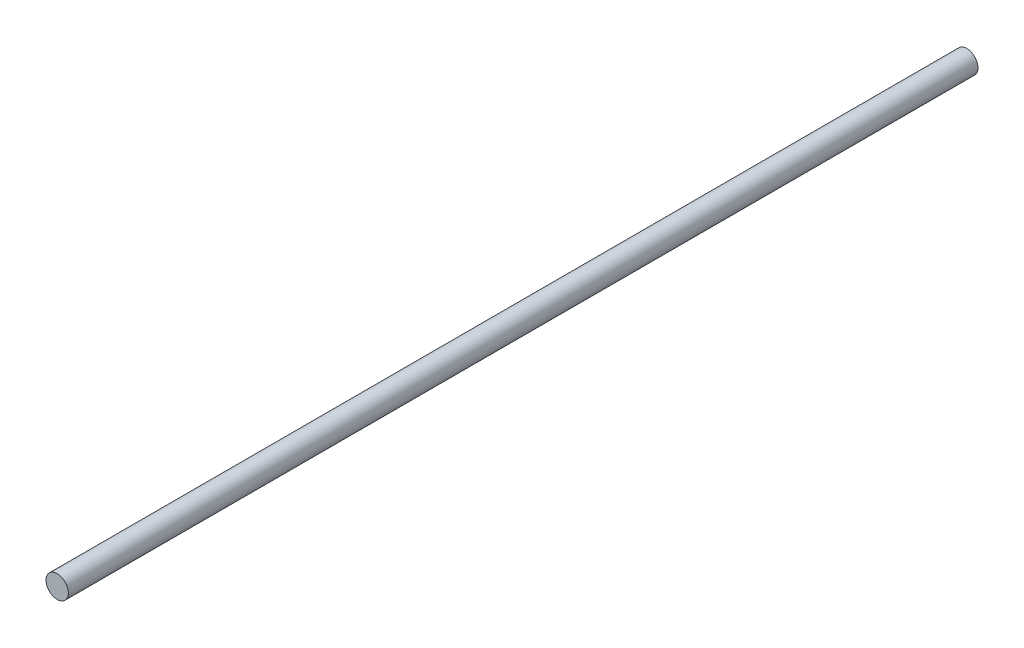
ISO-10303-21;
HEADER;
FILE_DESCRIPTION(('STEP AP214'),'2;1');
FILE_NAME('part.step','',(''),(''),'','','');
FILE_SCHEMA(('AUTOMOTIVE_DESIGN { 1 0 10303 214 1 1 1 1 }'));
ENDSEC;
DATA;
#1=APPLICATION_CONTEXT('core data for automotive mechanical design processes');
#2=APPLICATION_PROTOCOL_DEFINITION('international standard','automotive_design',2000,#1);
#3=PRODUCT_CONTEXT('',#1,'mechanical');
#4=PRODUCT('Part','Part','',(#3));
#5=PRODUCT_RELATED_PRODUCT_CATEGORY('part','',(#4));
#6=PRODUCT_DEFINITION_FORMATION('','',#4);
#7=PRODUCT_DEFINITION_CONTEXT('part definition',#1,'design');
#8=PRODUCT_DEFINITION('design','',#6,#7);
#9=PRODUCT_DEFINITION_SHAPE('','',#8);
#10=(LENGTH_UNIT() NAMED_UNIT(*) SI_UNIT(.MILLI.,.METRE.));
#11=(NAMED_UNIT(*) PLANE_ANGLE_UNIT() SI_UNIT($,.RADIAN.));
#12=(NAMED_UNIT(*) SI_UNIT($,.STERADIAN.) SOLID_ANGLE_UNIT());
#13=UNCERTAINTY_MEASURE_WITH_UNIT(LENGTH_MEASURE(1.E-05),#10,'distance_accuracy_value','');
#14=(GEOMETRIC_REPRESENTATION_CONTEXT(3) GLOBAL_UNCERTAINTY_ASSIGNED_CONTEXT((#13)) GLOBAL_UNIT_ASSIGNED_CONTEXT((#10,
#11,#12)) REPRESENTATION_CONTEXT('',''));
#15=CARTESIAN_POINT('',(0.,0.,0.));
#16=DIRECTION('',(0.,0.,1.));
#17=DIRECTION('',(1.,0.,0.));
#18=AXIS2_PLACEMENT_3D('',#15,#16,#17);
#19=CARTESIAN_POINT('',(0.,0.,4133.088));
#20=DIRECTION('',(0.,0.,-1.));
#21=DIRECTION('',(-1.,0.,0.));
#22=AXIS2_PLACEMENT_3D('',#19,#20,#21);
#23=CYLINDRICAL_SURFACE('',#22,50.8);
#24=CARTESIAN_POINT('',(0.,0.,4133.088));
#25=DIRECTION('',(0.,0.,1.));
#26=DIRECTION('',(1.,0.,0.));
#27=AXIS2_PLACEMENT_3D('',#24,#25,#26);
#28=CIRCLE('',#27,50.8);
#29=CARTESIAN_POINT('',(50.8,0.,4133.088));
#30=VERTEX_POINT('',#29);
#31=EDGE_CURVE('E10',#30,#30,#28,.T.);
#32=ORIENTED_EDGE('',*,*,#31,.F.);
#33=EDGE_LOOP('',(#32));
#34=FACE_BOUND('',#33,.T.);
#35=CARTESIAN_POINT('',(0.,0.,0.));
#36=DIRECTION('',(0.,0.,1.));
#37=DIRECTION('',(1.,0.,0.));
#38=AXIS2_PLACEMENT_3D('',#35,#36,#37);
#39=CIRCLE('',#38,50.8);
#40=CARTESIAN_POINT('',(50.8,0.,0.));
#41=VERTEX_POINT('',#40);
#42=EDGE_CURVE('E34',#41,#41,#39,.T.);
#43=ORIENTED_EDGE('',*,*,#42,.T.);
#44=EDGE_LOOP('',(#43));
#45=FACE_BOUND('',#44,.T.);
#46=ADVANCED_FACE('F31',(#34,#45),#23,.T.);
#47=CARTESIAN_POINT('',(0.,0.,4133.088));
#48=DIRECTION('',(0.,0.,1.));
#49=DIRECTION('',(1.,0.,0.));
#50=AXIS2_PLACEMENT_3D('',#47,#48,#49);
#51=PLANE('',#50);
#52=ORIENTED_EDGE('',*,*,#31,.T.);
#53=EDGE_LOOP('',(#52));
#54=FACE_BOUND('',#53,.T.);
#55=ADVANCED_FACE('F46',(#54),#51,.T.);
#56=CARTESIAN_POINT('',(0.,0.,0.));
#57=DIRECTION('',(0.,0.,1.));
#58=DIRECTION('',(1.,0.,0.));
#59=AXIS2_PLACEMENT_3D('',#56,#57,#58);
#60=PLANE('',#59);
#61=ORIENTED_EDGE('',*,*,#42,.F.);
#62=EDGE_LOOP('',(#61));
#63=FACE_BOUND('',#62,.T.);
#64=ADVANCED_FACE('F44',(#63),#60,.F.);
#65=CLOSED_SHELL('',(#46,#55,#64));
#66=MANIFOLD_SOLID_BREP('B2',#65);
#67=ADVANCED_BREP_SHAPE_REPRESENTATION('',(#18,#66),#14);
#68=SHAPE_DEFINITION_REPRESENTATION(#9,#67);
ENDSEC;
END-ISO-10303-21;
